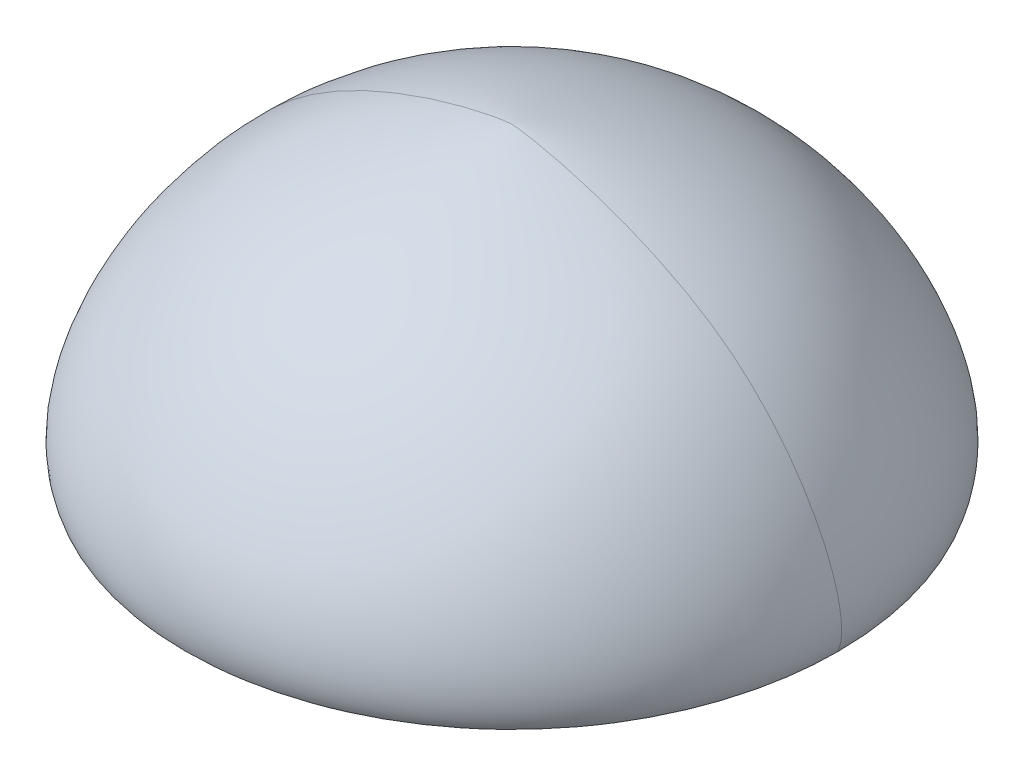
ISO-10303-21;
HEADER;
FILE_DESCRIPTION(('STEP AP214'),'2;1');
FILE_NAME('part.step','',(''),(''),'','','');
FILE_SCHEMA(('AUTOMOTIVE_DESIGN { 1 0 10303 214 1 1 1 1 }'));
ENDSEC;
DATA;
#1=APPLICATION_CONTEXT('core data for automotive mechanical design processes');
#2=APPLICATION_PROTOCOL_DEFINITION('international standard','automotive_design',2000,#1);
#3=PRODUCT_CONTEXT('',#1,'mechanical');
#4=PRODUCT('Part','Part','',(#3));
#5=PRODUCT_RELATED_PRODUCT_CATEGORY('part','',(#4));
#6=PRODUCT_DEFINITION_FORMATION('','',#4);
#7=PRODUCT_DEFINITION_CONTEXT('part definition',#1,'design');
#8=PRODUCT_DEFINITION('design','',#6,#7);
#9=PRODUCT_DEFINITION_SHAPE('','',#8);
#10=(LENGTH_UNIT() NAMED_UNIT(*) SI_UNIT(.MILLI.,.METRE.));
#11=(NAMED_UNIT(*) PLANE_ANGLE_UNIT() SI_UNIT($,.RADIAN.));
#12=(NAMED_UNIT(*) SI_UNIT($,.STERADIAN.) SOLID_ANGLE_UNIT());
#13=UNCERTAINTY_MEASURE_WITH_UNIT(LENGTH_MEASURE(1.E-05),#10,'distance_accuracy_value','');
#14=(GEOMETRIC_REPRESENTATION_CONTEXT(3) GLOBAL_UNCERTAINTY_ASSIGNED_CONTEXT((#13)) GLOBAL_UNIT_ASSIGNED_CONTEXT((#10,
#11,#12)) REPRESENTATION_CONTEXT('',''));
#15=CARTESIAN_POINT('',(0.,0.,0.));
#16=DIRECTION('',(0.,0.,1.));
#17=DIRECTION('',(1.,0.,0.));
#18=AXIS2_PLACEMENT_3D('',#15,#16,#17);
#19=CARTESIAN_POINT('',(-0.5,0.,0.));
#20=CARTESIAN_POINT('',(-0.5,0.,1.));
#21=CARTESIAN_POINT('',(0.5,0.,1.));
#22=CARTESIAN_POINT('',(0.5,0.,0.));
#23=CARTESIAN_POINT('',(-0.525443724020926,0.0623045036922683,0.));
#24=CARTESIAN_POINT('',(-0.525443724020926,0.0623045036922683,1.05088744804185));
#25=CARTESIAN_POINT('',(0.525443724020926,0.0623045036922682,1.05088744804185));
#26=CARTESIAN_POINT('',(0.525443724020926,0.0623045036922682,0.));
#27=CARTESIAN_POINT('',(-0.389704349266153,0.378890471474151,0.));
#28=CARTESIAN_POINT('',(-0.389704349266153,0.378890471474151,0.779408698532305));
#29=CARTESIAN_POINT('',(0.389704349266153,0.378890471474151,0.779408698532306));
#30=CARTESIAN_POINT('',(0.389704349266153,0.378890471474151,0.));
#31=CARTESIAN_POINT('',(-0.0254904385884981,0.45,0.));
#32=CARTESIAN_POINT('',(-0.0254904385884981,0.45,0.0509808771769963));
#33=CARTESIAN_POINT('',(0.0254904385884982,0.45,0.0509808771769963));
#34=CARTESIAN_POINT('',(0.0254904385884982,0.45,0.));
#35=CARTESIAN_POINT('',(0.,0.45,0.));
#36=CARTESIAN_POINT('',(0.,0.45,0.));
#37=CARTESIAN_POINT('',(0.,0.45,0.));
#38=CARTESIAN_POINT('',(0.,0.45,0.));
#39=(BOUNDED_SURFACE() B_SPLINE_SURFACE(3,3,((#19,#20,#21,#22),(#23,#24,#25,#26),(#27,#28,#29,
#30),(#31,#32,#33,#34),(#35,#36,#37,#38)),.UNSPECIFIED.,.F.,.F.,
.F.) B_SPLINE_SURFACE_WITH_KNOTS((4,1,4),(4,4),(0.,0.503823142963827,1.),(0.,1.),
.UNSPECIFIED.) GEOMETRIC_REPRESENTATION_ITEM() RATIONAL_B_SPLINE_SURFACE(((1.,0.333333333333333,
0.333333333333333,1.),(1.,0.333333333333333,0.333333333333333,1.),(1.,0.333333333333333,
0.333333333333333,1.),(1.,0.333333333333333,0.333333333333333,1.),(1.,0.333333333333333,
0.333333333333333,1.))) REPRESENTATION_ITEM('') SURFACE());
#40=CARTESIAN_POINT('',(-0.5,0.,0.));
#41=CARTESIAN_POINT('',(-0.500048149130047,0.,0.0369859489214546));
#42=CARTESIAN_POINT('',(-0.495893498953565,0.,0.0739083275837042));
#43=CARTESIAN_POINT('',(-0.481667605002963,0.,0.136956319291758));
#44=CARTESIAN_POINT('',(-0.473328667561291,0.,0.163479692694338));
#45=CARTESIAN_POINT('',(-0.452370618197223,0.,0.214780577947688));
#46=CARTESIAN_POINT('',(-0.439751506274827,0.,0.239558089798459));
#47=CARTESIAN_POINT('',(-0.410578625507133,0.,0.286691534413926));
#48=CARTESIAN_POINT('',(-0.394024856661834,0.,0.309047467178622));
#49=CARTESIAN_POINT('',(-0.36664209457526,0.,0.340242451441447));
#50=CARTESIAN_POINT('',(-0.357103250808137,0.,0.350239440509597));
#51=CARTESIAN_POINT('',(-0.337233854183991,0.,0.369410463701577));
#52=CARTESIAN_POINT('',(-0.326903301326968,0.,0.378584497825408));
#53=CARTESIAN_POINT('',(-0.294743117043244,0.,0.40483505605589));
#54=CARTESIAN_POINT('',(-0.271792971087489,0.,0.420585369394438));
#55=CARTESIAN_POINT('',(-0.235742846204319,0.,0.441155088766055));
#56=CARTESIAN_POINT('',(-0.223472376176938,0.,0.447496083011092));
#57=CARTESIAN_POINT('',(-0.18583773075164,0.,0.4650027989805));
#58=CARTESIAN_POINT('',(-0.159710288939309,0.,0.474611148387529));
#59=CARTESIAN_POINT('',(-0.119700723711009,0.,0.485658774277028));
#60=CARTESIAN_POINT('',(-0.106245878861882,0.,0.488778614000398));
#61=CARTESIAN_POINT('',(-0.0654570793712742,0.,0.496465980270292));
#62=CARTESIAN_POINT('',(-0.0377671095089072,0.,0.499336304714867));
#63=CARTESIAN_POINT('',(0.00373122959780928,0.,0.500178765809988));
#64=CARTESIAN_POINT('',(0.0175399225454233,0.,0.499885044647641));
#65=CARTESIAN_POINT('',(0.0589648283895701,0.,0.497278865867513));
#66=CARTESIAN_POINT('',(0.0865075491663683,0.,0.493233944409549));
#67=CARTESIAN_POINT('',(0.126932909630627,0.,0.483818847345867));
#68=CARTESIAN_POINT('',(0.140243128322547,0.,0.480129511995547));
#69=CARTESIAN_POINT('',(0.179745843633391,0.,0.467391630742455));
#70=CARTESIAN_POINT('',(0.205438467459824,0.,0.456683830415687));
#71=CARTESIAN_POINT('',(0.242299556805051,0.,0.437587533893389));
#72=CARTESIAN_POINT('',(0.254292394051834,0.,0.430727250647658));
#73=CARTESIAN_POINT('',(0.2776709604481,0.,0.416040125595179));
#74=CARTESIAN_POINT('',(0.289056689597583,0.,0.40821328378843));
#75=CARTESIAN_POINT('',(0.322259211387137,0.,0.383293894527351));
#76=CARTESIAN_POINT('',(0.343056740414211,0.,0.364795974683044));
#77=CARTESIAN_POINT('',(0.371678479886279,0.,0.334734793884432));
#78=CARTESIAN_POINT('',(0.380779768426911,0.,0.32434373562372));
#79=CARTESIAN_POINT('',(0.406805175979961,0.,0.292016457430968));
#80=CARTESIAN_POINT('',(0.42239651522958,0.,0.268974537260019));
#81=CARTESIAN_POINT('',(0.449540872137095,0.,0.220642856744909));
#82=CARTESIAN_POINT('',(0.461093889794992,0.,0.195353096400746));
#83=CARTESIAN_POINT('',(0.480067458152247,0.,0.142604896376728));
#84=CARTESIAN_POINT('',(0.48738694787569,0.,0.115109976343689));
#85=CARTESIAN_POINT('',(0.497440486101525,0.,0.058429995809743));
#86=CARTESIAN_POINT('',(0.500028262159024,0.,0.0292189643514074));
#87=CARTESIAN_POINT('',(0.5,0.,0.));
#88=B_SPLINE_CURVE_WITH_KNOTS('',3,(#40,#41,#42,#43,#44,#45,#46,#47,#48,#49,#50,#51,#52,#53,#54,
#55,#56,#57,#58,#59,#60,#61,#62,#63,#64,#65,#66,#67,#68,#69,#70,#71,#72,#73,#74,#75,#76,#77,#78,
#79,#80,#81,#82,#83,#84,#85,#86,#87),.UNSPECIFIED.,.F.,.F.,(4,2,2,2,2,2,2,2,2,2,2,2,2,2,2,2,2,2,
2,2,2,2,2,4),(0.,0.110597476907472,0.193635658097383,0.276673839287293,0.359712020477204,
0.401123242414322,0.442534464351434,0.525572645541345,0.566983867478448,0.650022048668348,
0.691433270605451,0.774471451795351,0.815882673732454,0.898920854922345,0.940332076859448,
1.02337025804887,1.06478147998597,1.10619270192307,1.18923088311297,1.23064210505,
1.3136802862399,1.3967184674298,1.48166479414007,1.56919535763596),.UNSPECIFIED.);
#89=CARTESIAN_POINT('',(-0.5,0.,0.));
#90=VERTEX_POINT('',#89);
#91=CARTESIAN_POINT('',(0.5,0.,0.));
#92=VERTEX_POINT('',#91);
#93=EDGE_CURVE('E23',#90,#92,#88,.T.);
#94=CARTESIAN_POINT('',(0.5,0.,0.));
#95=CARTESIAN_POINT('',(0.525443724020926,0.0623045036922682,0.));
#96=CARTESIAN_POINT('',(0.389704349266153,0.378890471474151,0.));
#97=CARTESIAN_POINT('',(0.0254904385884982,0.45,0.));
#98=CARTESIAN_POINT('',(0.,0.45,0.));
#99=B_SPLINE_CURVE_WITH_KNOTS('',3,(#94,#95,#96,#97,#98),.UNSPECIFIED.,.F.,.F.,(4,1,4),(0.,
0.503823142963827,1.),.UNSPECIFIED.);
#100=CARTESIAN_POINT('',(0.,0.45,0.));
#101=VERTEX_POINT('',#100);
#102=EDGE_CURVE('E37',#92,#101,#99,.T.);
#103=CARTESIAN_POINT('',(-0.5,0.,0.));
#104=CARTESIAN_POINT('',(-0.525443724020926,0.0623045036922683,0.));
#105=CARTESIAN_POINT('',(-0.389704349266153,0.378890471474151,0.));
#106=CARTESIAN_POINT('',(-0.0254904385884981,0.45,0.));
#107=CARTESIAN_POINT('',(0.,0.45,0.));
#108=B_SPLINE_CURVE_WITH_KNOTS('',3,(#103,#104,#105,#106,#107),.UNSPECIFIED.,.F.,.F.,(4,1,4),
(0.,0.503823142963827,1.),.UNSPECIFIED.);
#109=EDGE_CURVE('E45',#101,#90,#108,.F.);
#110=ORIENTED_EDGE('',*,*,#93,.T.);
#111=ORIENTED_EDGE('',*,*,#102,.T.);
#112=ORIENTED_EDGE('',*,*,#109,.T.);
#113=EDGE_LOOP('',(#110,#111,#112));
#114=FACE_BOUND('',#113,.T.);
#115=ADVANCED_FACE('F17',(#114),#39,.F.);
#116=CARTESIAN_POINT('',(0.5,0.,0.));
#117=CARTESIAN_POINT('',(0.5,0.,-1.));
#118=CARTESIAN_POINT('',(-0.5,0.,-1.));
#119=CARTESIAN_POINT('',(-0.5,0.,0.));
#120=CARTESIAN_POINT('',(0.525443724020926,0.0623045036922682,0.));
#121=CARTESIAN_POINT('',(0.525443724020926,0.0623045036922682,-1.05088744804185));
#122=CARTESIAN_POINT('',(-0.525443724020926,0.0623045036922683,-1.05088744804185));
#123=CARTESIAN_POINT('',(-0.525443724020926,0.0623045036922683,0.));
#124=CARTESIAN_POINT('',(0.389704349266153,0.378890471474151,0.));
#125=CARTESIAN_POINT('',(0.389704349266153,0.378890471474151,-0.779408698532306));
#126=CARTESIAN_POINT('',(-0.389704349266153,0.378890471474151,-0.779408698532305));
#127=CARTESIAN_POINT('',(-0.389704349266153,0.378890471474151,0.));
#128=CARTESIAN_POINT('',(0.0254904385884982,0.45,0.));
#129=CARTESIAN_POINT('',(0.0254904385884982,0.45,-0.0509808771769963));
#130=CARTESIAN_POINT('',(-0.0254904385884981,0.45,-0.0509808771769963));
#131=CARTESIAN_POINT('',(-0.0254904385884981,0.45,0.));
#132=CARTESIAN_POINT('',(0.,0.45,0.));
#133=CARTESIAN_POINT('',(0.,0.45,0.));
#134=CARTESIAN_POINT('',(0.,0.45,0.));
#135=CARTESIAN_POINT('',(0.,0.45,0.));
#136=(BOUNDED_SURFACE() B_SPLINE_SURFACE(3,3,((#116,#117,#118,#119),(#120,#121,#122,#123),(#124,
#125,#126,#127),(#128,#129,#130,#131),(#132,#133,#134,#135)),.UNSPECIFIED.,.F.,.F.,
.F.) B_SPLINE_SURFACE_WITH_KNOTS((4,1,4),(4,4),(0.,0.503823142963827,1.),(0.,1.),
.UNSPECIFIED.) GEOMETRIC_REPRESENTATION_ITEM() RATIONAL_B_SPLINE_SURFACE(((1.,0.333333333333333,
0.333333333333333,1.),(1.,0.333333333333333,0.333333333333333,1.),(1.,0.333333333333333,
0.333333333333333,1.),(1.,0.333333333333333,0.333333333333333,1.),(1.,0.333333333333333,
0.333333333333333,1.))) REPRESENTATION_ITEM('') SURFACE());
#137=CARTESIAN_POINT('',(0.5,0.,0.));
#138=CARTESIAN_POINT('',(0.500048149130048,0.,-0.0369859489214549));
#139=CARTESIAN_POINT('',(0.495893498953565,0.,-0.0739083275837043));
#140=CARTESIAN_POINT('',(0.481667605002963,0.,-0.136956319291758));
#141=CARTESIAN_POINT('',(0.47332866756129,0.,-0.163479692694338));
#142=CARTESIAN_POINT('',(0.452370618197222,0.,-0.214780577947689));
#143=CARTESIAN_POINT('',(0.439751506274826,0.,-0.239558089798459));
#144=CARTESIAN_POINT('',(0.410578625507132,0.,-0.286691534413926));
#145=CARTESIAN_POINT('',(0.394024856661834,0.,-0.309047467178622));
#146=CARTESIAN_POINT('',(0.366642094575259,0.,-0.340242451441448));
#147=CARTESIAN_POINT('',(0.357103250808136,0.,-0.350239440509597));
#148=CARTESIAN_POINT('',(0.33723385418399,0.,-0.369410463701577));
#149=CARTESIAN_POINT('',(0.326903301326968,0.,-0.378584497825408));
#150=CARTESIAN_POINT('',(0.294743117043243,0.,-0.40483505605589));
#151=CARTESIAN_POINT('',(0.271792971087488,0.,-0.420585369394439));
#152=CARTESIAN_POINT('',(0.235742846204318,0.,-0.441155088766055));
#153=CARTESIAN_POINT('',(0.223472376176937,0.,-0.447496083011092));
#154=CARTESIAN_POINT('',(0.18583773075164,0.,-0.4650027989805));
#155=CARTESIAN_POINT('',(0.159710288939308,0.,-0.474611148387529));
#156=CARTESIAN_POINT('',(0.119700723711009,0.,-0.485658774277028));
#157=CARTESIAN_POINT('',(0.106245878861882,0.,-0.488778614000398));
#158=CARTESIAN_POINT('',(0.0654570793712743,0.,-0.496465980270291));
#159=CARTESIAN_POINT('',(0.0377671095089075,0.,-0.499336304714867));
#160=CARTESIAN_POINT('',(-0.00373122959780881,0.,-0.500178765809988));
#161=CARTESIAN_POINT('',(-0.0175399225454228,0.,-0.499885044647641));
#162=CARTESIAN_POINT('',(-0.0589648283895693,0.,-0.497278865867513));
#163=CARTESIAN_POINT('',(-0.0865075491663674,0.,-0.49323394440955));
#164=CARTESIAN_POINT('',(-0.126932909630626,0.,-0.483818847345867));
#165=CARTESIAN_POINT('',(-0.140243128322546,0.,-0.480129511995547));
#166=CARTESIAN_POINT('',(-0.17974584363339,0.,-0.467391630742455));
#167=CARTESIAN_POINT('',(-0.205438467459823,0.,-0.456683830415688));
#168=CARTESIAN_POINT('',(-0.24229955680505,0.,-0.43758753389339));
#169=CARTESIAN_POINT('',(-0.254292394051833,0.,-0.430727250647659));
#170=CARTESIAN_POINT('',(-0.277670960448098,0.,-0.41604012559518));
#171=CARTESIAN_POINT('',(-0.289056689597582,0.,-0.408213283788431));
#172=CARTESIAN_POINT('',(-0.322259211387135,0.,-0.383293894527352));
#173=CARTESIAN_POINT('',(-0.343056740414209,0.,-0.364795974683045));
#174=CARTESIAN_POINT('',(-0.371678479886278,0.,-0.334734793884434));
#175=CARTESIAN_POINT('',(-0.38077976842691,0.,-0.324343735623721));
#176=CARTESIAN_POINT('',(-0.40680517597996,0.,-0.29201645743097));
#177=CARTESIAN_POINT('',(-0.422396515229579,0.,-0.268974537260021));
#178=CARTESIAN_POINT('',(-0.449540872137094,0.,-0.220642856744911));
#179=CARTESIAN_POINT('',(-0.461093889794991,0.,-0.195353096400749));
#180=CARTESIAN_POINT('',(-0.480067458152247,0.,-0.14260489637673));
#181=CARTESIAN_POINT('',(-0.48738694787569,0.,-0.115109976343691));
#182=CARTESIAN_POINT('',(-0.497440486101525,0.,-0.058429995809744));
#183=CARTESIAN_POINT('',(-0.500028262159024,0.,-0.0292189643514078));
#184=CARTESIAN_POINT('',(-0.5,0.,0.));
#185=B_SPLINE_CURVE_WITH_KNOTS('',3,(#137,#138,#139,#140,#141,#142,#143,#144,#145,#146,#147,
#148,#149,#150,#151,#152,#153,#154,#155,#156,#157,#158,#159,#160,#161,#162,#163,#164,#165,#166,
#167,#168,#169,#170,#171,#172,#173,#174,#175,#176,#177,#178,#179,#180,#181,#182,#183,#184),
.UNSPECIFIED.,.F.,.F.,(4,2,2,2,2,2,2,2,2,2,2,2,2,2,2,2,2,2,2,2,2,2,2,4),(0.,0.110597476907472,
0.193635658097383,0.276673839287294,0.359712020477205,0.401123242414322,0.442534464351435,
0.525572645541345,0.566983867478448,0.650022048668348,0.691433270605451,0.77447145179535,
0.815882673732453,0.898920854922344,0.940332076859447,1.02337025804887,1.06478147998597,
1.10619270192307,1.18923088311296,1.23064210505,1.3136802862399,1.3967184674298,
1.48166479414007,1.56919535763596),.UNSPECIFIED.);
#186=EDGE_CURVE('E11',#92,#90,#185,.T.);
#187=ORIENTED_EDGE('',*,*,#109,.F.);
#188=ORIENTED_EDGE('',*,*,#102,.F.);
#189=ORIENTED_EDGE('',*,*,#186,.T.);
#190=EDGE_LOOP('',(#187,#188,#189));
#191=FACE_BOUND('',#190,.T.);
#192=ADVANCED_FACE('F46',(#191),#136,.F.);
#193=CARTESIAN_POINT('',(0.,0.,0.));
#194=DIRECTION('',(0.,1.,0.));
#195=DIRECTION('',(-1.,0.,0.));
#196=AXIS2_PLACEMENT_3D('',#193,#194,#195);
#197=PLANE('',#196);
#198=ORIENTED_EDGE('',*,*,#93,.F.);
#199=ORIENTED_EDGE('',*,*,#186,.F.);
#200=EDGE_LOOP('',(#198,#199));
#201=FACE_BOUND('',#200,.T.);
#202=ADVANCED_FACE('F67',(#201),#197,.F.);
#203=CLOSED_SHELL('',(#115,#192,#202));
#204=MANIFOLD_SOLID_BREP('B1',#203);
#205=ADVANCED_BREP_SHAPE_REPRESENTATION('',(#18,#204),#14);
#206=SHAPE_DEFINITION_REPRESENTATION(#9,#205);
ENDSEC;
END-ISO-10303-21;
